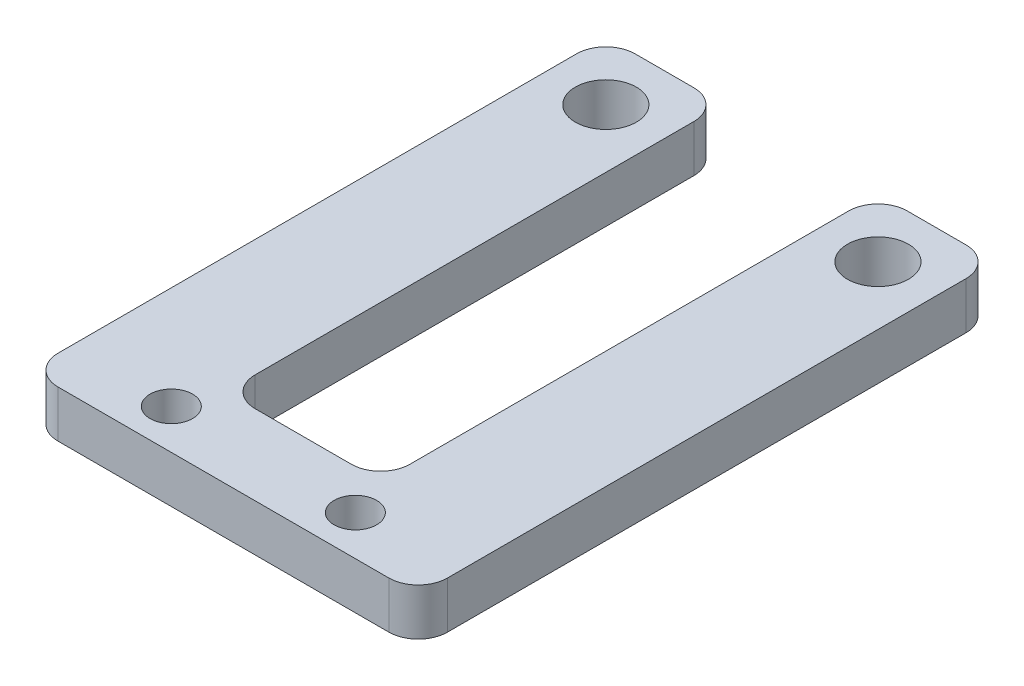
ISO-10303-21;
HEADER;
FILE_DESCRIPTION(('STEP AP214'),'2;1');
FILE_NAME('part.step','',(''),(''),'','','');
FILE_SCHEMA(('AUTOMOTIVE_DESIGN { 1 0 10303 214 1 1 1 1 }'));
ENDSEC;
DATA;
#1=APPLICATION_CONTEXT('core data for automotive mechanical design processes');
#2=APPLICATION_PROTOCOL_DEFINITION('international standard','automotive_design',2000,#1);
#3=PRODUCT_CONTEXT('',#1,'mechanical');
#4=PRODUCT('Part','Part','',(#3));
#5=PRODUCT_RELATED_PRODUCT_CATEGORY('part','',(#4));
#6=PRODUCT_DEFINITION_FORMATION('','',#4);
#7=PRODUCT_DEFINITION_CONTEXT('part definition',#1,'design');
#8=PRODUCT_DEFINITION('design','',#6,#7);
#9=PRODUCT_DEFINITION_SHAPE('','',#8);
#10=(LENGTH_UNIT() NAMED_UNIT(*) SI_UNIT(.MILLI.,.METRE.));
#11=(NAMED_UNIT(*) PLANE_ANGLE_UNIT() SI_UNIT($,.RADIAN.));
#12=(NAMED_UNIT(*) SI_UNIT($,.STERADIAN.) SOLID_ANGLE_UNIT());
#13=UNCERTAINTY_MEASURE_WITH_UNIT(LENGTH_MEASURE(1.E-05),#10,'distance_accuracy_value','');
#14=(GEOMETRIC_REPRESENTATION_CONTEXT(3) GLOBAL_UNCERTAINTY_ASSIGNED_CONTEXT((#13)) GLOBAL_UNIT_ASSIGNED_CONTEXT((#10,
#11,#12)) REPRESENTATION_CONTEXT('',''));
#15=CARTESIAN_POINT('',(0.,0.,0.));
#16=DIRECTION('',(0.,0.,1.));
#17=DIRECTION('',(1.,0.,0.));
#18=AXIS2_PLACEMENT_3D('',#15,#16,#17);
#19=CARTESIAN_POINT('',(1.5875,2.54,1.5875));
#20=DIRECTION('',(0.,-1.,0.));
#21=DIRECTION('',(0.,0.,-1.));
#22=AXIS2_PLACEMENT_3D('',#19,#20,#21);
#23=PLANE('',#22);
#24=CARTESIAN_POINT('',(1.5875,2.54,1.5875));
#25=DIRECTION('',(0.,1.,0.));
#26=DIRECTION('',(0.,0.,-1.));
#27=AXIS2_PLACEMENT_3D('',#24,#25,#26);
#28=CIRCLE('',#27,1.5875);
#29=CARTESIAN_POINT('',(1.58750000000001,2.54,0.));
#30=VERTEX_POINT('',#29);
#31=CARTESIAN_POINT('',(0.,2.54,1.58750000000001));
#32=VERTEX_POINT('',#31);
#33=EDGE_CURVE('E215',#30,#32,#28,.T.);
#34=ORIENTED_EDGE('',*,*,#33,.T.);
#35=DIRECTION('',(0.,0.,1.));
#36=VECTOR('',#35,1.);
#37=CARTESIAN_POINT('',(0.,2.54,1.58750000000001));
#38=LINE('',#37,#36);
#39=CARTESIAN_POINT('',(0.,2.54,29.6545));
#40=VERTEX_POINT('',#39);
#41=EDGE_CURVE('E123',#32,#40,#38,.T.);
#42=ORIENTED_EDGE('',*,*,#41,.T.);
#43=CARTESIAN_POINT('',(1.5875,2.54,29.6545));
#44=DIRECTION('',(0.,1.,0.));
#45=DIRECTION('',(0.,0.,1.));
#46=AXIS2_PLACEMENT_3D('',#43,#44,#45);
#47=CIRCLE('',#46,1.5875);
#48=CARTESIAN_POINT('',(1.5875,2.54,31.242));
#49=VERTEX_POINT('',#48);
#50=EDGE_CURVE('E254',#40,#49,#47,.T.);
#51=ORIENTED_EDGE('',*,*,#50,.T.);
#52=DIRECTION('',(1.,0.,0.));
#53=VECTOR('',#52,1.);
#54=CARTESIAN_POINT('',(1.58750000000002,2.54,31.242));
#55=LINE('',#54,#53);
#56=CARTESIAN_POINT('',(19.4945,2.54,31.242));
#57=VERTEX_POINT('',#56);
#58=EDGE_CURVE('E273',#49,#57,#55,.T.);
#59=ORIENTED_EDGE('',*,*,#58,.T.);
#60=CARTESIAN_POINT('',(19.4945,2.54,29.6545));
#61=DIRECTION('',(0.,1.,0.));
#62=DIRECTION('',(0.,0.,-1.));
#63=AXIS2_PLACEMENT_3D('',#60,#61,#62);
#64=CIRCLE('',#63,1.5875);
#65=CARTESIAN_POINT('',(21.082,2.54,29.6545));
#66=VERTEX_POINT('',#65);
#67=EDGE_CURVE('E270',#57,#66,#64,.T.);
#68=ORIENTED_EDGE('',*,*,#67,.T.);
#69=DIRECTION('',(0.,0.,-1.));
#70=VECTOR('',#69,1.);
#71=CARTESIAN_POINT('',(21.082,2.54,1.58750000000001));
#72=LINE('',#71,#70);
#73=CARTESIAN_POINT('',(21.082,2.54,1.58750000000001));
#74=VERTEX_POINT('',#73);
#75=EDGE_CURVE('E272',#66,#74,#72,.T.);
#76=ORIENTED_EDGE('',*,*,#75,.T.);
#77=CARTESIAN_POINT('',(19.4945,2.54,1.5875));
#78=DIRECTION('',(0.,1.,0.));
#79=DIRECTION('',(0.,0.,-1.));
#80=AXIS2_PLACEMENT_3D('',#77,#78,#79);
#81=CIRCLE('',#80,1.5875);
#82=CARTESIAN_POINT('',(19.4945,2.54,0.));
#83=VERTEX_POINT('',#82);
#84=EDGE_CURVE('E275',#74,#83,#81,.T.);
#85=ORIENTED_EDGE('',*,*,#84,.T.);
#86=DIRECTION('',(-1.,0.,0.));
#87=VECTOR('',#86,1.);
#88=CARTESIAN_POINT('',(16.3195,2.54,0.));
#89=LINE('',#88,#87);
#90=CARTESIAN_POINT('',(16.3195,2.54,0.));
#91=VERTEX_POINT('',#90);
#92=EDGE_CURVE('E281',#83,#91,#89,.T.);
#93=ORIENTED_EDGE('',*,*,#92,.T.);
#94=CARTESIAN_POINT('',(16.3195,2.54,1.5875));
#95=DIRECTION('',(0.,1.,0.));
#96=DIRECTION('',(0.,0.,1.));
#97=AXIS2_PLACEMENT_3D('',#94,#95,#96);
#98=CIRCLE('',#97,1.5875);
#99=CARTESIAN_POINT('',(14.732,2.54,1.58750000000001));
#100=VERTEX_POINT('',#99);
#101=EDGE_CURVE('E283',#91,#100,#98,.T.);
#102=ORIENTED_EDGE('',*,*,#101,.T.);
#103=DIRECTION('',(0.,0.,1.));
#104=VECTOR('',#103,1.);
#105=CARTESIAN_POINT('',(14.732,2.54,25.3365));
#106=LINE('',#105,#104);
#107=CARTESIAN_POINT('',(14.732,2.54,25.3365));
#108=VERTEX_POINT('',#107);
#109=EDGE_CURVE('E285',#100,#108,#106,.T.);
#110=ORIENTED_EDGE('',*,*,#109,.T.);
#111=CARTESIAN_POINT('',(13.1445,2.54,25.3365));
#112=DIRECTION('',(0.,-1.,0.));
#113=DIRECTION('',(0.,0.,-1.));
#114=AXIS2_PLACEMENT_3D('',#111,#112,#113);
#115=CIRCLE('',#114,1.5875);
#116=CARTESIAN_POINT('',(13.1445,2.54,26.924));
#117=VERTEX_POINT('',#116);
#118=EDGE_CURVE('E287',#108,#117,#115,.T.);
#119=ORIENTED_EDGE('',*,*,#118,.T.);
#120=DIRECTION('',(-1.,0.,0.));
#121=VECTOR('',#120,1.);
#122=CARTESIAN_POINT('',(13.1445,2.54,26.924));
#123=LINE('',#122,#121);
#124=CARTESIAN_POINT('',(7.93750000000001,2.54,26.924));
#125=VERTEX_POINT('',#124);
#126=EDGE_CURVE('E289',#117,#125,#123,.T.);
#127=ORIENTED_EDGE('',*,*,#126,.T.);
#128=CARTESIAN_POINT('',(7.9375,2.54,25.3365));
#129=DIRECTION('',(0.,-1.,0.));
#130=DIRECTION('',(0.,0.,-1.));
#131=AXIS2_PLACEMENT_3D('',#128,#129,#130);
#132=CIRCLE('',#131,1.5875);
#133=CARTESIAN_POINT('',(6.35,2.54,25.3365));
#134=VERTEX_POINT('',#133);
#135=EDGE_CURVE('E166',#125,#134,#132,.T.);
#136=ORIENTED_EDGE('',*,*,#135,.T.);
#137=DIRECTION('',(0.,0.,-1.));
#138=VECTOR('',#137,1.);
#139=CARTESIAN_POINT('',(6.35,2.54,25.3365));
#140=LINE('',#139,#138);
#141=CARTESIAN_POINT('',(6.35,2.54,1.58750000000001));
#142=VERTEX_POINT('',#141);
#143=EDGE_CURVE('E160',#134,#142,#140,.T.);
#144=ORIENTED_EDGE('',*,*,#143,.T.);
#145=CARTESIAN_POINT('',(4.7625,2.54,1.5875));
#146=DIRECTION('',(0.,1.,0.));
#147=DIRECTION('',(0.,0.,1.));
#148=AXIS2_PLACEMENT_3D('',#145,#146,#147);
#149=CIRCLE('',#148,1.5875);
#150=CARTESIAN_POINT('',(4.76249999999999,2.54,0.));
#151=VERTEX_POINT('',#150);
#152=EDGE_CURVE('E164',#142,#151,#149,.T.);
#153=ORIENTED_EDGE('',*,*,#152,.T.);
#154=DIRECTION('',(-1.,0.,0.));
#155=VECTOR('',#154,1.);
#156=CARTESIAN_POINT('',(4.76249999999999,2.54,0.));
#157=LINE('',#156,#155);
#158=EDGE_CURVE('E56',#151,#30,#157,.T.);
#159=ORIENTED_EDGE('',*,*,#158,.T.);
#160=EDGE_LOOP('',(#34,#42,#51,#59,#68,#76,#85,#93,#102,#110,#119,#127,#136,#144,#153,#159));
#161=FACE_BOUND('',#160,.T.);
#162=CARTESIAN_POINT('',(3.175,2.54,3.175));
#163=DIRECTION('',(0.,1.,0.));
#164=DIRECTION('',(0.,0.,1.));
#165=AXIS2_PLACEMENT_3D('',#162,#163,#164);
#166=CIRCLE('',#165,1.65);
#167=CARTESIAN_POINT('',(3.175,2.54,4.825));
#168=VERTEX_POINT('',#167);
#169=EDGE_CURVE('E188',#168,#168,#166,.T.);
#170=ORIENTED_EDGE('',*,*,#169,.F.);
#171=EDGE_LOOP('',(#170));
#172=FACE_BOUND('',#171,.T.);
#173=CARTESIAN_POINT('',(5.5593,2.54,29.083));
#174=DIRECTION('',(0.,1.,0.));
#175=DIRECTION('',(0.,0.,1.));
#176=AXIS2_PLACEMENT_3D('',#173,#174,#175);
#177=CIRCLE('',#176,1.15);
#178=CARTESIAN_POINT('',(5.5593,2.54,30.233));
#179=VERTEX_POINT('',#178);
#180=EDGE_CURVE('E353',#179,#179,#177,.T.);
#181=ORIENTED_EDGE('',*,*,#180,.F.);
#182=EDGE_LOOP('',(#181));
#183=FACE_BOUND('',#182,.T.);
#184=CARTESIAN_POINT('',(15.5227,2.54,29.083));
#185=DIRECTION('',(0.,1.,0.));
#186=DIRECTION('',(0.,0.,-1.));
#187=AXIS2_PLACEMENT_3D('',#184,#185,#186);
#188=CIRCLE('',#187,1.15);
#189=CARTESIAN_POINT('',(15.5227,2.54,27.933));
#190=VERTEX_POINT('',#189);
#191=EDGE_CURVE('E347',#190,#190,#188,.T.);
#192=ORIENTED_EDGE('',*,*,#191,.F.);
#193=EDGE_LOOP('',(#192));
#194=FACE_BOUND('',#193,.T.);
#195=CARTESIAN_POINT('',(17.907,2.54,3.175));
#196=DIRECTION('',(0.,1.,0.));
#197=DIRECTION('',(0.,0.,-1.));
#198=AXIS2_PLACEMENT_3D('',#195,#196,#197);
#199=CIRCLE('',#198,1.65);
#200=CARTESIAN_POINT('',(17.907,2.54,1.525));
#201=VERTEX_POINT('',#200);
#202=EDGE_CURVE('E338',#201,#201,#199,.T.);
#203=ORIENTED_EDGE('',*,*,#202,.F.);
#204=EDGE_LOOP('',(#203));
#205=FACE_BOUND('',#204,.T.);
#206=ADVANCED_FACE('F39',(#161,#172,#183,#194,#205),#23,.F.);
#207=CARTESIAN_POINT('',(1.5875,0.,1.5875));
#208=DIRECTION('',(0.,-1.,0.));
#209=DIRECTION('',(0.,0.,-1.));
#210=AXIS2_PLACEMENT_3D('',#207,#208,#209);
#211=PLANE('',#210);
#212=CARTESIAN_POINT('',(15.5227,0.,29.083));
#213=DIRECTION('',(0.,1.,0.));
#214=DIRECTION('',(0.,0.,-1.));
#215=AXIS2_PLACEMENT_3D('',#212,#213,#214);
#216=CIRCLE('',#215,1.15);
#217=CARTESIAN_POINT('',(15.5227,0.,27.933));
#218=VERTEX_POINT('',#217);
#219=EDGE_CURVE('E344',#218,#218,#216,.T.);
#220=ORIENTED_EDGE('',*,*,#219,.T.);
#221=EDGE_LOOP('',(#220));
#222=FACE_BOUND('',#221,.T.);
#223=CARTESIAN_POINT('',(3.175,0.,3.175));
#224=DIRECTION('',(0.,1.,0.));
#225=DIRECTION('',(0.,0.,1.));
#226=AXIS2_PLACEMENT_3D('',#223,#224,#225);
#227=CIRCLE('',#226,1.65);
#228=CARTESIAN_POINT('',(3.175,0.,4.825));
#229=VERTEX_POINT('',#228);
#230=EDGE_CURVE('E356',#229,#229,#227,.T.);
#231=ORIENTED_EDGE('',*,*,#230,.T.);
#232=EDGE_LOOP('',(#231));
#233=FACE_BOUND('',#232,.T.);
#234=CARTESIAN_POINT('',(1.5875,0.,1.5875));
#235=DIRECTION('',(0.,1.,0.));
#236=DIRECTION('',(0.,0.,-1.));
#237=AXIS2_PLACEMENT_3D('',#234,#235,#236);
#238=CIRCLE('',#237,1.5875);
#239=CARTESIAN_POINT('',(1.58750000000001,0.,0.));
#240=VERTEX_POINT('',#239);
#241=CARTESIAN_POINT('',(0.,0.,1.58750000000001));
#242=VERTEX_POINT('',#241);
#243=EDGE_CURVE('E184',#240,#242,#238,.T.);
#244=ORIENTED_EDGE('',*,*,#243,.F.);
#245=DIRECTION('',(-1.,0.,0.));
#246=VECTOR('',#245,1.);
#247=CARTESIAN_POINT('',(4.76249999999999,0.,0.));
#248=LINE('',#247,#246);
#249=CARTESIAN_POINT('',(4.76249999999999,0.,0.));
#250=VERTEX_POINT('',#249);
#251=EDGE_CURVE('E115',#250,#240,#248,.T.);
#252=ORIENTED_EDGE('',*,*,#251,.F.);
#253=CARTESIAN_POINT('',(4.7625,0.,1.5875));
#254=DIRECTION('',(0.,1.,0.));
#255=DIRECTION('',(0.,0.,1.));
#256=AXIS2_PLACEMENT_3D('',#253,#254,#255);
#257=CIRCLE('',#256,1.5875);
#258=CARTESIAN_POINT('',(6.35,0.,1.58750000000001));
#259=VERTEX_POINT('',#258);
#260=EDGE_CURVE('E109',#259,#250,#257,.T.);
#261=ORIENTED_EDGE('',*,*,#260,.F.);
#262=DIRECTION('',(0.,0.,-1.));
#263=VECTOR('',#262,1.);
#264=CARTESIAN_POINT('',(6.35,0.,25.3365));
#265=LINE('',#264,#263);
#266=CARTESIAN_POINT('',(6.35,0.,25.3365));
#267=VERTEX_POINT('',#266);
#268=EDGE_CURVE('E174',#267,#259,#265,.T.);
#269=ORIENTED_EDGE('',*,*,#268,.F.);
#270=CARTESIAN_POINT('',(7.9375,0.,25.3365));
#271=DIRECTION('',(0.,-1.,0.));
#272=DIRECTION('',(0.,0.,-1.));
#273=AXIS2_PLACEMENT_3D('',#270,#271,#272);
#274=CIRCLE('',#273,1.5875);
#275=CARTESIAN_POINT('',(7.93750000000001,0.,26.924));
#276=VERTEX_POINT('',#275);
#277=EDGE_CURVE('E210',#276,#267,#274,.T.);
#278=ORIENTED_EDGE('',*,*,#277,.F.);
#279=DIRECTION('',(-1.,0.,0.));
#280=VECTOR('',#279,1.);
#281=CARTESIAN_POINT('',(13.1445,0.,26.924));
#282=LINE('',#281,#280);
#283=CARTESIAN_POINT('',(13.1445,0.,26.924));
#284=VERTEX_POINT('',#283);
#285=EDGE_CURVE('E208',#284,#276,#282,.T.);
#286=ORIENTED_EDGE('',*,*,#285,.F.);
#287=CARTESIAN_POINT('',(13.1445,0.,25.3365));
#288=DIRECTION('',(0.,-1.,0.));
#289=DIRECTION('',(0.,0.,-1.));
#290=AXIS2_PLACEMENT_3D('',#287,#288,#289);
#291=CIRCLE('',#290,1.5875);
#292=CARTESIAN_POINT('',(14.732,0.,25.3365));
#293=VERTEX_POINT('',#292);
#294=EDGE_CURVE('E206',#293,#284,#291,.T.);
#295=ORIENTED_EDGE('',*,*,#294,.F.);
#296=DIRECTION('',(0.,0.,1.));
#297=VECTOR('',#296,1.);
#298=CARTESIAN_POINT('',(14.732,0.,25.3365));
#299=LINE('',#298,#297);
#300=CARTESIAN_POINT('',(14.732,0.,1.58750000000001));
#301=VERTEX_POINT('',#300);
#302=EDGE_CURVE('E204',#301,#293,#299,.T.);
#303=ORIENTED_EDGE('',*,*,#302,.F.);
#304=CARTESIAN_POINT('',(16.3195,0.,1.5875));
#305=DIRECTION('',(0.,1.,0.));
#306=DIRECTION('',(0.,0.,1.));
#307=AXIS2_PLACEMENT_3D('',#304,#305,#306);
#308=CIRCLE('',#307,1.5875);
#309=CARTESIAN_POINT('',(16.3195,0.,0.));
#310=VERTEX_POINT('',#309);
#311=EDGE_CURVE('E202',#310,#301,#308,.T.);
#312=ORIENTED_EDGE('',*,*,#311,.F.);
#313=DIRECTION('',(-1.,0.,0.));
#314=VECTOR('',#313,1.);
#315=CARTESIAN_POINT('',(16.3195,0.,0.));
#316=LINE('',#315,#314);
#317=CARTESIAN_POINT('',(19.4945,0.,0.));
#318=VERTEX_POINT('',#317);
#319=EDGE_CURVE('E200',#318,#310,#316,.T.);
#320=ORIENTED_EDGE('',*,*,#319,.F.);
#321=CARTESIAN_POINT('',(19.4945,0.,1.5875));
#322=DIRECTION('',(0.,1.,0.));
#323=DIRECTION('',(0.,0.,-1.));
#324=AXIS2_PLACEMENT_3D('',#321,#322,#323);
#325=CIRCLE('',#324,1.5875);
#326=CARTESIAN_POINT('',(21.082,0.,1.58750000000001));
#327=VERTEX_POINT('',#326);
#328=EDGE_CURVE('E198',#327,#318,#325,.T.);
#329=ORIENTED_EDGE('',*,*,#328,.F.);
#330=DIRECTION('',(0.,0.,-1.));
#331=VECTOR('',#330,1.);
#332=CARTESIAN_POINT('',(21.082,0.,1.58750000000001));
#333=LINE('',#332,#331);
#334=CARTESIAN_POINT('',(21.082,0.,29.6545));
#335=VERTEX_POINT('',#334);
#336=EDGE_CURVE('E196',#335,#327,#333,.T.);
#337=ORIENTED_EDGE('',*,*,#336,.F.);
#338=CARTESIAN_POINT('',(19.4945,0.,29.6545));
#339=DIRECTION('',(0.,1.,0.));
#340=DIRECTION('',(0.,0.,-1.));
#341=AXIS2_PLACEMENT_3D('',#338,#339,#340);
#342=CIRCLE('',#341,1.5875);
#343=CARTESIAN_POINT('',(19.4945,0.,31.242));
#344=VERTEX_POINT('',#343);
#345=EDGE_CURVE('E194',#344,#335,#342,.T.);
#346=ORIENTED_EDGE('',*,*,#345,.F.);
#347=DIRECTION('',(1.,0.,0.));
#348=VECTOR('',#347,1.);
#349=CARTESIAN_POINT('',(1.58750000000002,0.,31.242));
#350=LINE('',#349,#348);
#351=CARTESIAN_POINT('',(1.5875,0.,31.242));
#352=VERTEX_POINT('',#351);
#353=EDGE_CURVE('E192',#352,#344,#350,.T.);
#354=ORIENTED_EDGE('',*,*,#353,.F.);
#355=CARTESIAN_POINT('',(1.5875,0.,29.6545));
#356=DIRECTION('',(0.,1.,0.));
#357=DIRECTION('',(0.,0.,1.));
#358=AXIS2_PLACEMENT_3D('',#355,#356,#357);
#359=CIRCLE('',#358,1.5875);
#360=CARTESIAN_POINT('',(0.,0.,29.6545));
#361=VERTEX_POINT('',#360);
#362=EDGE_CURVE('E190',#361,#352,#359,.T.);
#363=ORIENTED_EDGE('',*,*,#362,.F.);
#364=DIRECTION('',(0.,0.,1.));
#365=VECTOR('',#364,1.);
#366=CARTESIAN_POINT('',(0.,0.,1.58750000000001));
#367=LINE('',#366,#365);
#368=EDGE_CURVE('E187',#242,#361,#367,.T.);
#369=ORIENTED_EDGE('',*,*,#368,.F.);
#370=EDGE_LOOP('',(#244,#252,#261,#269,#278,#286,#295,#303,#312,#320,#329,#337,#346,#354,#363,#369));
#371=FACE_BOUND('',#370,.T.);
#372=CARTESIAN_POINT('',(5.5593,0.,29.083));
#373=DIRECTION('',(0.,1.,0.));
#374=DIRECTION('',(0.,0.,1.));
#375=AXIS2_PLACEMENT_3D('',#372,#373,#374);
#376=CIRCLE('',#375,1.15);
#377=CARTESIAN_POINT('',(5.5593,0.,30.233));
#378=VERTEX_POINT('',#377);
#379=EDGE_CURVE('E350',#378,#378,#376,.T.);
#380=ORIENTED_EDGE('',*,*,#379,.T.);
#381=EDGE_LOOP('',(#380));
#382=FACE_BOUND('',#381,.T.);
#383=CARTESIAN_POINT('',(17.907,0.,3.175));
#384=DIRECTION('',(0.,1.,0.));
#385=DIRECTION('',(0.,0.,-1.));
#386=AXIS2_PLACEMENT_3D('',#383,#384,#385);
#387=CIRCLE('',#386,1.65);
#388=CARTESIAN_POINT('',(17.907,0.,1.525));
#389=VERTEX_POINT('',#388);
#390=EDGE_CURVE('E341',#389,#389,#387,.T.);
#391=ORIENTED_EDGE('',*,*,#390,.T.);
#392=EDGE_LOOP('',(#391));
#393=FACE_BOUND('',#392,.T.);
#394=ADVANCED_FACE('F258',(#222,#233,#371,#382,#393),#211,.T.);
#395=CARTESIAN_POINT('',(1.5875,2.54,1.5875));
#396=DIRECTION('',(0.,-1.,0.));
#397=DIRECTION('',(0.,0.,-1.));
#398=AXIS2_PLACEMENT_3D('',#395,#396,#397);
#399=CYLINDRICAL_SURFACE('',#398,1.5875);
#400=ORIENTED_EDGE('',*,*,#243,.T.);
#401=DIRECTION('',(0.,-1.,0.));
#402=VECTOR('',#401,1.);
#403=CARTESIAN_POINT('',(0.,2.54,1.58750000000001));
#404=LINE('',#403,#402);
#405=EDGE_CURVE('E11',#32,#242,#404,.T.);
#406=ORIENTED_EDGE('',*,*,#405,.F.);
#407=ORIENTED_EDGE('',*,*,#33,.F.);
#408=DIRECTION('',(0.,-1.,0.));
#409=VECTOR('',#408,1.);
#410=CARTESIAN_POINT('',(1.58750000000001,2.54,0.));
#411=LINE('',#410,#409);
#412=EDGE_CURVE('E180',#30,#240,#411,.T.);
#413=ORIENTED_EDGE('',*,*,#412,.T.);
#414=EDGE_LOOP('',(#400,#406,#407,#413));
#415=FACE_BOUND('',#414,.T.);
#416=ADVANCED_FACE('F41',(#415),#399,.T.);
#417=CARTESIAN_POINT('',(0.,2.54,1.58750000000001));
#418=DIRECTION('',(1.,0.,0.));
#419=DIRECTION('',(0.,0.,-1.));
#420=AXIS2_PLACEMENT_3D('',#417,#418,#419);
#421=PLANE('',#420);
#422=ORIENTED_EDGE('',*,*,#368,.T.);
#423=DIRECTION('',(0.,-1.,0.));
#424=VECTOR('',#423,1.);
#425=CARTESIAN_POINT('',(0.,2.54,29.6545));
#426=LINE('',#425,#424);
#427=EDGE_CURVE('E48',#40,#361,#426,.T.);
#428=ORIENTED_EDGE('',*,*,#427,.F.);
#429=ORIENTED_EDGE('',*,*,#41,.F.);
#430=ORIENTED_EDGE('',*,*,#405,.T.);
#431=EDGE_LOOP('',(#422,#428,#429,#430));
#432=FACE_BOUND('',#431,.T.);
#433=ADVANCED_FACE('F512',(#432),#421,.F.);
#434=CARTESIAN_POINT('',(1.5875,2.54,29.6545));
#435=DIRECTION('',(0.,-1.,0.));
#436=DIRECTION('',(0.,0.,-1.));
#437=AXIS2_PLACEMENT_3D('',#434,#435,#436);
#438=CYLINDRICAL_SURFACE('',#437,1.5875);
#439=ORIENTED_EDGE('',*,*,#362,.T.);
#440=DIRECTION('',(0.,-1.,0.));
#441=VECTOR('',#440,1.);
#442=CARTESIAN_POINT('',(1.5875,2.54,31.242));
#443=LINE('',#442,#441);
#444=EDGE_CURVE('E246',#49,#352,#443,.T.);
#445=ORIENTED_EDGE('',*,*,#444,.F.);
#446=ORIENTED_EDGE('',*,*,#50,.F.);
#447=ORIENTED_EDGE('',*,*,#427,.T.);
#448=EDGE_LOOP('',(#439,#445,#446,#447));
#449=FACE_BOUND('',#448,.T.);
#450=ADVANCED_FACE('F252',(#449),#438,.T.);
#451=CARTESIAN_POINT('',(1.58750000000002,2.54,31.242));
#452=DIRECTION('',(0.,0.,-1.));
#453=DIRECTION('',(-1.,0.,0.));
#454=AXIS2_PLACEMENT_3D('',#451,#452,#453);
#455=PLANE('',#454);
#456=ORIENTED_EDGE('',*,*,#353,.T.);
#457=DIRECTION('',(0.,-1.,0.));
#458=VECTOR('',#457,1.);
#459=CARTESIAN_POINT('',(19.4945,2.54,31.242));
#460=LINE('',#459,#458);
#461=EDGE_CURVE('E243',#57,#344,#460,.T.);
#462=ORIENTED_EDGE('',*,*,#461,.F.);
#463=ORIENTED_EDGE('',*,*,#58,.F.);
#464=ORIENTED_EDGE('',*,*,#444,.T.);
#465=EDGE_LOOP('',(#456,#462,#463,#464));
#466=FACE_BOUND('',#465,.T.);
#467=ADVANCED_FACE('F264',(#466),#455,.F.);
#468=CARTESIAN_POINT('',(19.4945,2.54,29.6545));
#469=DIRECTION('',(0.,-1.,0.));
#470=DIRECTION('',(0.,0.,-1.));
#471=AXIS2_PLACEMENT_3D('',#468,#469,#470);
#472=CYLINDRICAL_SURFACE('',#471,1.5875);
#473=ORIENTED_EDGE('',*,*,#345,.T.);
#474=DIRECTION('',(0.,-1.,0.));
#475=VECTOR('',#474,1.);
#476=CARTESIAN_POINT('',(21.082,2.54,29.6545));
#477=LINE('',#476,#475);
#478=EDGE_CURVE('E240',#66,#335,#477,.T.);
#479=ORIENTED_EDGE('',*,*,#478,.F.);
#480=ORIENTED_EDGE('',*,*,#67,.F.);
#481=ORIENTED_EDGE('',*,*,#461,.T.);
#482=EDGE_LOOP('',(#473,#479,#480,#481));
#483=FACE_BOUND('',#482,.T.);
#484=ADVANCED_FACE('F268',(#483),#472,.T.);
#485=CARTESIAN_POINT('',(21.082,2.54,1.58750000000001));
#486=DIRECTION('',(-1.,0.,0.));
#487=DIRECTION('',(0.,0.,1.));
#488=AXIS2_PLACEMENT_3D('',#485,#486,#487);
#489=PLANE('',#488);
#490=ORIENTED_EDGE('',*,*,#336,.T.);
#491=DIRECTION('',(0.,-1.,0.));
#492=VECTOR('',#491,1.);
#493=CARTESIAN_POINT('',(21.082,2.54,1.58750000000001));
#494=LINE('',#493,#492);
#495=EDGE_CURVE('E237',#74,#327,#494,.T.);
#496=ORIENTED_EDGE('',*,*,#495,.F.);
#497=ORIENTED_EDGE('',*,*,#75,.F.);
#498=ORIENTED_EDGE('',*,*,#478,.T.);
#499=EDGE_LOOP('',(#490,#496,#497,#498));
#500=FACE_BOUND('',#499,.T.);
#501=ADVANCED_FACE('F477',(#500),#489,.F.);
#502=CARTESIAN_POINT('',(19.4945,2.54,1.5875));
#503=DIRECTION('',(0.,-1.,0.));
#504=DIRECTION('',(0.,0.,-1.));
#505=AXIS2_PLACEMENT_3D('',#502,#503,#504);
#506=CYLINDRICAL_SURFACE('',#505,1.5875);
#507=ORIENTED_EDGE('',*,*,#328,.T.);
#508=DIRECTION('',(0.,-1.,0.));
#509=VECTOR('',#508,1.);
#510=CARTESIAN_POINT('',(19.4945,2.54,0.));
#511=LINE('',#510,#509);
#512=EDGE_CURVE('E234',#83,#318,#511,.T.);
#513=ORIENTED_EDGE('',*,*,#512,.F.);
#514=ORIENTED_EDGE('',*,*,#84,.F.);
#515=ORIENTED_EDGE('',*,*,#495,.T.);
#516=EDGE_LOOP('',(#507,#513,#514,#515));
#517=FACE_BOUND('',#516,.T.);
#518=ADVANCED_FACE('F467',(#517),#506,.T.);
#519=CARTESIAN_POINT('',(16.3195,2.54,0.));
#520=DIRECTION('',(0.,0.,1.));
#521=DIRECTION('',(1.,0.,0.));
#522=AXIS2_PLACEMENT_3D('',#519,#520,#521);
#523=PLANE('',#522);
#524=ORIENTED_EDGE('',*,*,#319,.T.);
#525=DIRECTION('',(0.,-1.,0.));
#526=VECTOR('',#525,1.);
#527=CARTESIAN_POINT('',(16.3195,2.54,0.));
#528=LINE('',#527,#526);
#529=EDGE_CURVE('E231',#91,#310,#528,.T.);
#530=ORIENTED_EDGE('',*,*,#529,.F.);
#531=ORIENTED_EDGE('',*,*,#92,.F.);
#532=ORIENTED_EDGE('',*,*,#512,.T.);
#533=EDGE_LOOP('',(#524,#530,#531,#532));
#534=FACE_BOUND('',#533,.T.);
#535=ADVANCED_FACE('F457',(#534),#523,.F.);
#536=CARTESIAN_POINT('',(16.3195,2.54,1.5875));
#537=DIRECTION('',(0.,-1.,0.));
#538=DIRECTION('',(0.,0.,-1.));
#539=AXIS2_PLACEMENT_3D('',#536,#537,#538);
#540=CYLINDRICAL_SURFACE('',#539,1.5875);
#541=ORIENTED_EDGE('',*,*,#311,.T.);
#542=DIRECTION('',(0.,-1.,0.));
#543=VECTOR('',#542,1.);
#544=CARTESIAN_POINT('',(14.732,2.54,1.58750000000001));
#545=LINE('',#544,#543);
#546=EDGE_CURVE('E228',#100,#301,#545,.T.);
#547=ORIENTED_EDGE('',*,*,#546,.F.);
#548=ORIENTED_EDGE('',*,*,#101,.F.);
#549=ORIENTED_EDGE('',*,*,#529,.T.);
#550=EDGE_LOOP('',(#541,#547,#548,#549));
#551=FACE_BOUND('',#550,.T.);
#552=ADVANCED_FACE('F447',(#551),#540,.T.);
#553=CARTESIAN_POINT('',(14.732,2.54,25.3365));
#554=DIRECTION('',(1.,0.,0.));
#555=DIRECTION('',(0.,0.,-1.));
#556=AXIS2_PLACEMENT_3D('',#553,#554,#555);
#557=PLANE('',#556);
#558=ORIENTED_EDGE('',*,*,#302,.T.);
#559=DIRECTION('',(0.,-1.,0.));
#560=VECTOR('',#559,1.);
#561=CARTESIAN_POINT('',(14.732,2.54,25.3365));
#562=LINE('',#561,#560);
#563=EDGE_CURVE('E225',#108,#293,#562,.T.);
#564=ORIENTED_EDGE('',*,*,#563,.F.);
#565=ORIENTED_EDGE('',*,*,#109,.F.);
#566=ORIENTED_EDGE('',*,*,#546,.T.);
#567=EDGE_LOOP('',(#558,#564,#565,#566));
#568=FACE_BOUND('',#567,.T.);
#569=ADVANCED_FACE('F437',(#568),#557,.F.);
#570=CARTESIAN_POINT('',(13.1445,2.54,25.3365));
#571=DIRECTION('',(0.,-1.,0.));
#572=DIRECTION('',(0.,0.,-1.));
#573=AXIS2_PLACEMENT_3D('',#570,#571,#572);
#574=CYLINDRICAL_SURFACE('',#573,1.5875);
#575=ORIENTED_EDGE('',*,*,#294,.T.);
#576=DIRECTION('',(0.,-1.,0.));
#577=VECTOR('',#576,1.);
#578=CARTESIAN_POINT('',(13.1445,2.54,26.924));
#579=LINE('',#578,#577);
#580=EDGE_CURVE('E222',#117,#284,#579,.T.);
#581=ORIENTED_EDGE('',*,*,#580,.F.);
#582=ORIENTED_EDGE('',*,*,#118,.F.);
#583=ORIENTED_EDGE('',*,*,#563,.T.);
#584=EDGE_LOOP('',(#575,#581,#582,#583));
#585=FACE_BOUND('',#584,.T.);
#586=ADVANCED_FACE('F428',(#585),#574,.F.);
#587=CARTESIAN_POINT('',(13.1445,2.54,26.924));
#588=DIRECTION('',(0.,0.,1.));
#589=DIRECTION('',(1.,0.,0.));
#590=AXIS2_PLACEMENT_3D('',#587,#588,#589);
#591=PLANE('',#590);
#592=ORIENTED_EDGE('',*,*,#285,.T.);
#593=DIRECTION('',(0.,-1.,0.));
#594=VECTOR('',#593,1.);
#595=CARTESIAN_POINT('',(7.93750000000001,2.54,26.924));
#596=LINE('',#595,#594);
#597=EDGE_CURVE('E219',#125,#276,#596,.T.);
#598=ORIENTED_EDGE('',*,*,#597,.F.);
#599=ORIENTED_EDGE('',*,*,#126,.F.);
#600=ORIENTED_EDGE('',*,*,#580,.T.);
#601=EDGE_LOOP('',(#592,#598,#599,#600));
#602=FACE_BOUND('',#601,.T.);
#603=ADVANCED_FACE('F295',(#602),#591,.F.);
#604=CARTESIAN_POINT('',(7.9375,2.54,25.3365));
#605=DIRECTION('',(0.,-1.,0.));
#606=DIRECTION('',(0.,0.,-1.));
#607=AXIS2_PLACEMENT_3D('',#604,#605,#606);
#608=CYLINDRICAL_SURFACE('',#607,1.5875);
#609=ORIENTED_EDGE('',*,*,#277,.T.);
#610=DIRECTION('',(0.,-1.,0.));
#611=VECTOR('',#610,1.);
#612=CARTESIAN_POINT('',(6.35,2.54,25.3365));
#613=LINE('',#612,#611);
#614=EDGE_CURVE('E175',#134,#267,#613,.T.);
#615=ORIENTED_EDGE('',*,*,#614,.F.);
#616=ORIENTED_EDGE('',*,*,#135,.F.);
#617=ORIENTED_EDGE('',*,*,#597,.T.);
#618=EDGE_LOOP('',(#609,#615,#616,#617));
#619=FACE_BOUND('',#618,.T.);
#620=ADVANCED_FACE('F299',(#619),#608,.F.);
#621=CARTESIAN_POINT('',(6.35,2.54,25.3365));
#622=DIRECTION('',(-1.,0.,0.));
#623=DIRECTION('',(0.,0.,1.));
#624=AXIS2_PLACEMENT_3D('',#621,#622,#623);
#625=PLANE('',#624);
#626=ORIENTED_EDGE('',*,*,#268,.T.);
#627=DIRECTION('',(0.,-1.,0.));
#628=VECTOR('',#627,1.);
#629=CARTESIAN_POINT('',(6.35,2.54,1.58750000000001));
#630=LINE('',#629,#628);
#631=EDGE_CURVE('E171',#142,#259,#630,.T.);
#632=ORIENTED_EDGE('',*,*,#631,.F.);
#633=ORIENTED_EDGE('',*,*,#143,.F.);
#634=ORIENTED_EDGE('',*,*,#614,.T.);
#635=EDGE_LOOP('',(#626,#632,#633,#634));
#636=FACE_BOUND('',#635,.T.);
#637=ADVANCED_FACE('F172',(#636),#625,.F.);
#638=CARTESIAN_POINT('',(4.7625,2.54,1.5875));
#639=DIRECTION('',(0.,-1.,0.));
#640=DIRECTION('',(0.,0.,-1.));
#641=AXIS2_PLACEMENT_3D('',#638,#639,#640);
#642=CYLINDRICAL_SURFACE('',#641,1.5875);
#643=ORIENTED_EDGE('',*,*,#260,.T.);
#644=DIRECTION('',(0.,-1.,0.));
#645=VECTOR('',#644,1.);
#646=CARTESIAN_POINT('',(4.76249999999999,2.54,0.));
#647=LINE('',#646,#645);
#648=EDGE_CURVE('E176',#151,#250,#647,.T.);
#649=ORIENTED_EDGE('',*,*,#648,.F.);
#650=ORIENTED_EDGE('',*,*,#152,.F.);
#651=ORIENTED_EDGE('',*,*,#631,.T.);
#652=EDGE_LOOP('',(#643,#649,#650,#651));
#653=FACE_BOUND('',#652,.T.);
#654=ADVANCED_FACE('F178',(#653),#642,.T.);
#655=CARTESIAN_POINT('',(4.76249999999999,2.54,0.));
#656=DIRECTION('',(0.,0.,1.));
#657=DIRECTION('',(1.,0.,0.));
#658=AXIS2_PLACEMENT_3D('',#655,#656,#657);
#659=PLANE('',#658);
#660=ORIENTED_EDGE('',*,*,#251,.T.);
#661=ORIENTED_EDGE('',*,*,#412,.F.);
#662=ORIENTED_EDGE('',*,*,#158,.F.);
#663=ORIENTED_EDGE('',*,*,#648,.T.);
#664=EDGE_LOOP('',(#660,#661,#662,#663));
#665=FACE_BOUND('',#664,.T.);
#666=ADVANCED_FACE('F303',(#665),#659,.F.);
#667=CARTESIAN_POINT('',(3.175,2.54,3.175));
#668=DIRECTION('',(0.,-1.,0.));
#669=DIRECTION('',(0.,0.,-1.));
#670=AXIS2_PLACEMENT_3D('',#667,#668,#669);
#671=CYLINDRICAL_SURFACE('',#670,1.65);
#672=ORIENTED_EDGE('',*,*,#169,.T.);
#673=EDGE_LOOP('',(#672));
#674=FACE_BOUND('',#673,.T.);
#675=ORIENTED_EDGE('',*,*,#230,.F.);
#676=EDGE_LOOP('',(#675));
#677=FACE_BOUND('',#676,.T.);
#678=ADVANCED_FACE('F305',(#674,#677),#671,.F.);
#679=CARTESIAN_POINT('',(5.5593,2.54,29.083));
#680=DIRECTION('',(0.,-1.,0.));
#681=DIRECTION('',(0.,0.,-1.));
#682=AXIS2_PLACEMENT_3D('',#679,#680,#681);
#683=CYLINDRICAL_SURFACE('',#682,1.15);
#684=ORIENTED_EDGE('',*,*,#180,.T.);
#685=EDGE_LOOP('',(#684));
#686=FACE_BOUND('',#685,.T.);
#687=ORIENTED_EDGE('',*,*,#379,.F.);
#688=EDGE_LOOP('',(#687));
#689=FACE_BOUND('',#688,.T.);
#690=ADVANCED_FACE('F311',(#686,#689),#683,.F.);
#691=CARTESIAN_POINT('',(15.5227,2.54,29.083));
#692=DIRECTION('',(0.,-1.,0.));
#693=DIRECTION('',(0.,0.,-1.));
#694=AXIS2_PLACEMENT_3D('',#691,#692,#693);
#695=CYLINDRICAL_SURFACE('',#694,1.15);
#696=ORIENTED_EDGE('',*,*,#191,.T.);
#697=EDGE_LOOP('',(#696));
#698=FACE_BOUND('',#697,.T.);
#699=ORIENTED_EDGE('',*,*,#219,.F.);
#700=EDGE_LOOP('',(#699));
#701=FACE_BOUND('',#700,.T.);
#702=ADVANCED_FACE('F325',(#698,#701),#695,.F.);
#703=CARTESIAN_POINT('',(17.907,2.54,3.175));
#704=DIRECTION('',(0.,-1.,0.));
#705=DIRECTION('',(0.,0.,-1.));
#706=AXIS2_PLACEMENT_3D('',#703,#704,#705);
#707=CYLINDRICAL_SURFACE('',#706,1.65);
#708=ORIENTED_EDGE('',*,*,#202,.T.);
#709=EDGE_LOOP('',(#708));
#710=FACE_BOUND('',#709,.T.);
#711=ORIENTED_EDGE('',*,*,#390,.F.);
#712=EDGE_LOOP('',(#711));
#713=FACE_BOUND('',#712,.T.);
#714=ADVANCED_FACE('F329',(#710,#713),#707,.F.);
#715=CLOSED_SHELL('',(#206,#394,#416,#433,#450,#467,#484,#501,#518,#535,#552,#569,#586,#603,
#620,#637,#654,#666,#678,#690,#702,#714));
#716=MANIFOLD_SOLID_BREP('B2',#715);
#717=ADVANCED_BREP_SHAPE_REPRESENTATION('',(#18,#716),#14);
#718=SHAPE_DEFINITION_REPRESENTATION(#9,#717);
ENDSEC;
END-ISO-10303-21;
